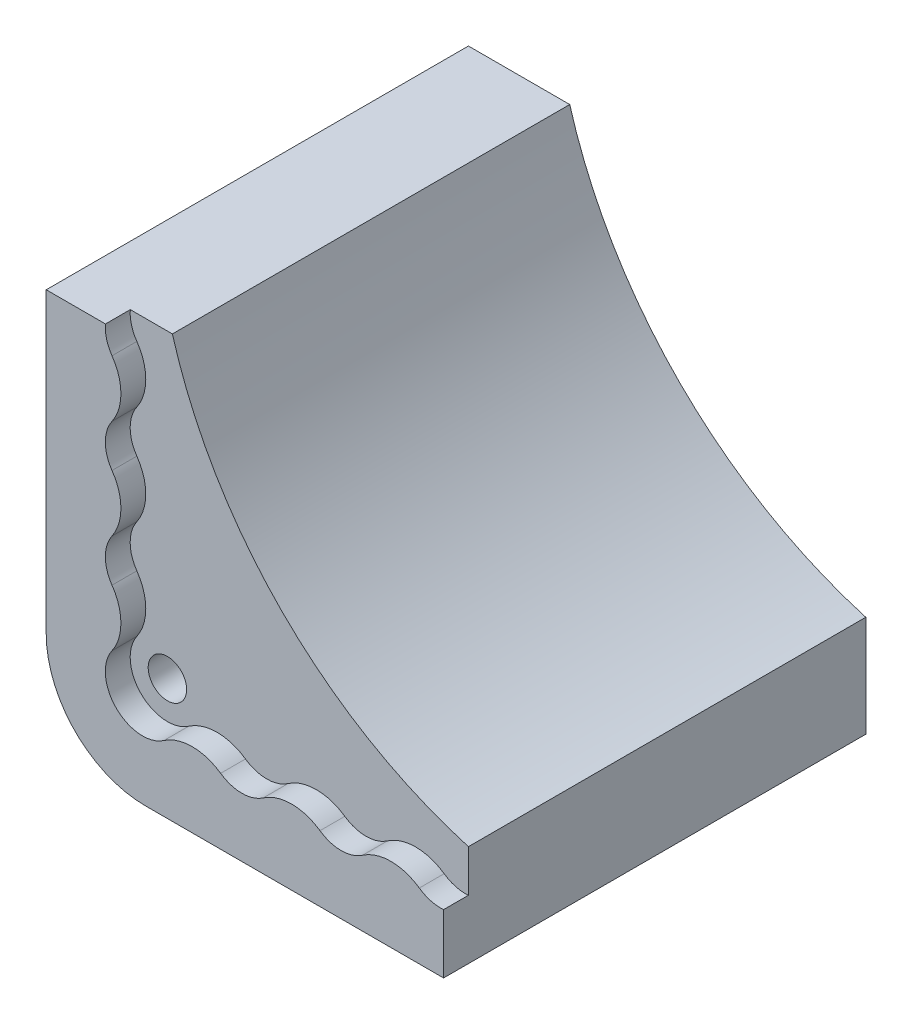
ISO-10303-21;
HEADER;
FILE_DESCRIPTION(('STEP AP214'),'2;1');
FILE_NAME('part.step','',(''),(''),'','','');
FILE_SCHEMA(('AUTOMOTIVE_DESIGN { 1 0 10303 214 1 1 1 1 }'));
ENDSEC;
DATA;
#1=APPLICATION_CONTEXT('core data for automotive mechanical design processes');
#2=APPLICATION_PROTOCOL_DEFINITION('international standard','automotive_design',2000,#1);
#3=PRODUCT_CONTEXT('',#1,'mechanical');
#4=PRODUCT('Part','Part','',(#3));
#5=PRODUCT_RELATED_PRODUCT_CATEGORY('part','',(#4));
#6=PRODUCT_DEFINITION_FORMATION('','',#4);
#7=PRODUCT_DEFINITION_CONTEXT('part definition',#1,'design');
#8=PRODUCT_DEFINITION('design','',#6,#7);
#9=PRODUCT_DEFINITION_SHAPE('','',#8);
#10=(LENGTH_UNIT() NAMED_UNIT(*) SI_UNIT(.MILLI.,.METRE.));
#11=(NAMED_UNIT(*) PLANE_ANGLE_UNIT() SI_UNIT($,.RADIAN.));
#12=(NAMED_UNIT(*) SI_UNIT($,.STERADIAN.) SOLID_ANGLE_UNIT());
#13=UNCERTAINTY_MEASURE_WITH_UNIT(LENGTH_MEASURE(1.E-05),#10,'distance_accuracy_value','');
#14=(GEOMETRIC_REPRESENTATION_CONTEXT(3) GLOBAL_UNCERTAINTY_ASSIGNED_CONTEXT((#13)) GLOBAL_UNIT_ASSIGNED_CONTEXT((#10,
#11,#12)) REPRESENTATION_CONTEXT('',''));
#15=CARTESIAN_POINT('',(0.,0.,0.));
#16=DIRECTION('',(0.,0.,1.));
#17=DIRECTION('',(1.,0.,0.));
#18=AXIS2_PLACEMENT_3D('',#15,#16,#17);
#19=CARTESIAN_POINT('',(12.319,12.319,53.975));
#20=DIRECTION('',(0.,0.,1.));
#21=DIRECTION('',(1.,0.,0.));
#22=AXIS2_PLACEMENT_3D('',#19,#20,#21);
#23=CYLINDRICAL_SURFACE('',#22,2.45744999999999);
#24=CARTESIAN_POINT('',(12.319,12.319,0.));
#25=DIRECTION('',(0.,0.,1.));
#26=DIRECTION('',(1.,0.,0.));
#27=AXIS2_PLACEMENT_3D('',#24,#25,#26);
#28=CIRCLE('',#27,2.45744999999999);
#29=CARTESIAN_POINT('',(14.77645,12.319,0.));
#30=VERTEX_POINT('',#29);
#31=EDGE_CURVE('E218',#30,#30,#28,.T.);
#32=ORIENTED_EDGE('',*,*,#31,.F.);
#33=EDGE_LOOP('',(#32));
#34=FACE_BOUND('',#33,.T.);
#35=CARTESIAN_POINT('',(12.319,12.319,50.8));
#36=DIRECTION('',(0.,0.,1.));
#37=DIRECTION('',(1.,0.,0.));
#38=AXIS2_PLACEMENT_3D('',#35,#36,#37);
#39=CIRCLE('',#38,2.45744999999999);
#40=CARTESIAN_POINT('',(14.77645,12.319,50.8));
#41=VERTEX_POINT('',#40);
#42=EDGE_CURVE('E277',#41,#41,#39,.F.);
#43=ORIENTED_EDGE('',*,*,#42,.F.);
#44=EDGE_LOOP('',(#43));
#45=FACE_BOUND('',#44,.T.);
#46=ADVANCED_FACE('F37',(#34,#45),#23,.F.);
#47=CARTESIAN_POINT('',(0.,0.,53.975));
#48=DIRECTION('',(0.,1.,0.));
#49=DIRECTION('',(0.,0.,1.));
#50=AXIS2_PLACEMENT_3D('',#47,#48,#49);
#51=PLANE('',#50);
#52=DIRECTION('',(0.,0.,1.));
#53=VECTOR('',#52,1.);
#54=CARTESIAN_POINT('',(12.7,0.,0.));
#55=LINE('',#54,#53);
#56=CARTESIAN_POINT('',(12.7,0.,0.));
#57=VERTEX_POINT('',#56);
#58=CARTESIAN_POINT('',(12.7,0.,53.975));
#59=VERTEX_POINT('',#58);
#60=EDGE_CURVE('E226',#57,#59,#55,.T.);
#61=ORIENTED_EDGE('',*,*,#60,.F.);
#62=DIRECTION('',(1.,0.,0.));
#63=VECTOR('',#62,1.);
#64=CARTESIAN_POINT('',(0.,0.,0.));
#65=LINE('',#64,#63);
#66=CARTESIAN_POINT('',(50.8,0.,0.));
#67=VERTEX_POINT('',#66);
#68=EDGE_CURVE('E203',#57,#67,#65,.T.);
#69=ORIENTED_EDGE('',*,*,#68,.T.);
#70=DIRECTION('',(0.,0.,-1.));
#71=VECTOR('',#70,1.);
#72=CARTESIAN_POINT('',(50.8,0.,53.975));
#73=LINE('',#72,#71);
#74=CARTESIAN_POINT('',(50.8,0.,53.975));
#75=VERTEX_POINT('',#74);
#76=EDGE_CURVE('E11',#75,#67,#73,.T.);
#77=ORIENTED_EDGE('',*,*,#76,.F.);
#78=DIRECTION('',(1.,0.,0.));
#79=VECTOR('',#78,1.);
#80=CARTESIAN_POINT('',(0.,0.,53.975));
#81=LINE('',#80,#79);
#82=EDGE_CURVE('E201',#59,#75,#81,.T.);
#83=ORIENTED_EDGE('',*,*,#82,.F.);
#84=EDGE_LOOP('',(#61,#69,#77,#83));
#85=FACE_BOUND('',#84,.T.);
#86=ADVANCED_FACE('F223',(#85),#51,.F.);
#87=CARTESIAN_POINT('',(0.,0.,53.975));
#88=DIRECTION('',(0.,0.,1.));
#89=DIRECTION('',(1.,0.,0.));
#90=AXIS2_PLACEMENT_3D('',#87,#88,#89);
#91=PLANE('',#90);
#92=CARTESIAN_POINT('',(12.3189999999996,50.419,53.975));
#93=DIRECTION('',(0.,0.,1.));
#94=DIRECTION('',(1.,0.,0.));
#95=AXIS2_PLACEMENT_3D('',#92,#93,#94);
#96=CIRCLE('',#95,4.76249999999993);
#97=CARTESIAN_POINT('',(7.57176446234196,50.8,53.975));
#98=VERTEX_POINT('',#97);
#99=CARTESIAN_POINT('',(8.41064577083715,47.6975714285715,53.975));
#100=VERTEX_POINT('',#99);
#101=EDGE_CURVE('E305',#98,#100,#96,.T.);
#102=ORIENTED_EDGE('',*,*,#101,.F.);
#103=DIRECTION('',(-1.,0.,0.));
#104=VECTOR('',#103,1.);
#105=CARTESIAN_POINT('',(25.4,50.8,53.975));
#106=LINE('',#105,#104);
#107=CARTESIAN_POINT('',(0.,50.8,53.975));
#108=VERTEX_POINT('',#107);
#109=EDGE_CURVE('E206',#98,#108,#106,.T.);
#110=ORIENTED_EDGE('',*,*,#109,.T.);
#111=DIRECTION('',(0.,-1.,0.));
#112=VECTOR('',#111,1.);
#113=CARTESIAN_POINT('',(0.,50.8,53.975));
#114=LINE('',#113,#112);
#115=CARTESIAN_POINT('',(0.,12.7,53.975));
#116=VERTEX_POINT('',#115);
#117=EDGE_CURVE('E197',#108,#116,#114,.T.);
#118=ORIENTED_EDGE('',*,*,#117,.T.);
#119=CARTESIAN_POINT('',(12.7,12.7,53.975));
#120=DIRECTION('',(0.,0.,1.));
#121=DIRECTION('',(1.,0.,0.));
#122=AXIS2_PLACEMENT_3D('',#119,#120,#121);
#123=CIRCLE('',#122,12.7);
#124=EDGE_CURVE('E237',#116,#59,#123,.T.);
#125=ORIENTED_EDGE('',*,*,#124,.T.);
#126=ORIENTED_EDGE('',*,*,#82,.T.);
#127=DIRECTION('',(0.,1.,0.));
#128=VECTOR('',#127,1.);
#129=CARTESIAN_POINT('',(50.8,0.,53.975));
#130=LINE('',#129,#128);
#131=CARTESIAN_POINT('',(50.8,7.57176446234279,53.975));
#132=VERTEX_POINT('',#131);
#133=EDGE_CURVE('E209',#75,#132,#130,.T.);
#134=ORIENTED_EDGE('',*,*,#133,.T.);
#135=CARTESIAN_POINT('',(50.419,12.3190000000004,53.975));
#136=DIRECTION('',(0.,0.,1.));
#137=DIRECTION('',(1.,0.,0.));
#138=AXIS2_PLACEMENT_3D('',#135,#136,#137);
#139=CIRCLE('',#138,4.76249999999992);
#140=CARTESIAN_POINT('',(47.6975714285715,8.41064577083791,53.975));
#141=VERTEX_POINT('',#140);
#142=EDGE_CURVE('E235',#141,#132,#139,.T.);
#143=ORIENTED_EDGE('',*,*,#142,.F.);
#144=CARTESIAN_POINT('',(44.0690000000001,3.19950679862127,53.975));
#145=DIRECTION('',(0.,0.,1.));
#146=DIRECTION('',(1.,0.,0.));
#147=AXIS2_PLACEMENT_3D('',#144,#145,#146);
#148=CIRCLE('',#147,6.35000000000002);
#149=CARTESIAN_POINT('',(40.4404285714286,8.41064577083788,53.975));
#150=VERTEX_POINT('',#149);
#151=EDGE_CURVE('E190',#141,#150,#148,.T.);
#152=ORIENTED_EDGE('',*,*,#151,.T.);
#153=CARTESIAN_POINT('',(37.719,12.3190000000003,53.975));
#154=DIRECTION('',(0.,0.,1.));
#155=DIRECTION('',(1.,0.,0.));
#156=AXIS2_PLACEMENT_3D('',#153,#154,#155);
#157=CIRCLE('',#156,4.76249999999992);
#158=CARTESIAN_POINT('',(34.9975714285715,8.4106457708378,53.975));
#159=VERTEX_POINT('',#158);
#160=EDGE_CURVE('E274',#159,#150,#157,.T.);
#161=ORIENTED_EDGE('',*,*,#160,.F.);
#162=CARTESIAN_POINT('',(31.3690000000001,3.19950679862115,53.975));
#163=DIRECTION('',(0.,0.,1.));
#164=DIRECTION('',(1.,0.,0.));
#165=AXIS2_PLACEMENT_3D('',#162,#163,#164);
#166=CIRCLE('',#165,6.34999999999998);
#167=CARTESIAN_POINT('',(27.7404285714286,8.41064577083774,53.975));
#168=VERTEX_POINT('',#167);
#169=EDGE_CURVE('E278',#159,#168,#166,.T.);
#170=ORIENTED_EDGE('',*,*,#169,.T.);
#171=CARTESIAN_POINT('',(25.019,12.3190000000001,53.975));
#172=DIRECTION('',(0.,0.,1.));
#173=DIRECTION('',(1.,0.,0.));
#174=AXIS2_PLACEMENT_3D('',#171,#172,#173);
#175=CIRCLE('',#174,4.76249999999997);
#176=CARTESIAN_POINT('',(22.2975714285715,8.41064577083764,53.975));
#177=VERTEX_POINT('',#176);
#178=EDGE_CURVE('E281',#177,#168,#175,.T.);
#179=ORIENTED_EDGE('',*,*,#178,.F.);
#180=CARTESIAN_POINT('',(18.6690000000001,3.19950679862095,53.975));
#181=DIRECTION('',(0.,0.,1.));
#182=DIRECTION('',(1.,0.,0.));
#183=AXIS2_PLACEMENT_3D('',#180,#181,#182);
#184=CIRCLE('',#183,6.35000000000001);
#185=CARTESIAN_POINT('',(15.0404285714286,8.41064577083755,53.975));
#186=VERTEX_POINT('',#185);
#187=EDGE_CURVE('E284',#177,#186,#184,.T.);
#188=ORIENTED_EDGE('',*,*,#187,.T.);
#189=CARTESIAN_POINT('',(12.319,12.319,53.975));
#190=DIRECTION('',(0.,0.,1.));
#191=DIRECTION('',(1.,0.,0.));
#192=AXIS2_PLACEMENT_3D('',#189,#190,#191);
#193=CIRCLE('',#192,4.7625);
#194=CARTESIAN_POINT('',(8.4106457708375,15.0404285714285,53.975));
#195=VERTEX_POINT('',#194);
#196=EDGE_CURVE('E287',#195,#186,#193,.T.);
#197=ORIENTED_EDGE('',*,*,#196,.F.);
#198=CARTESIAN_POINT('',(3.19950679862081,18.6689999999999,53.975));
#199=DIRECTION('',(0.,0.,1.));
#200=DIRECTION('',(1.,0.,0.));
#201=AXIS2_PLACEMENT_3D('',#198,#199,#200);
#202=CIRCLE('',#201,6.35);
#203=CARTESIAN_POINT('',(8.41064577083742,22.2975714285714,53.975));
#204=VERTEX_POINT('',#203);
#205=EDGE_CURVE('E290',#195,#204,#202,.T.);
#206=ORIENTED_EDGE('',*,*,#205,.T.);
#207=CARTESIAN_POINT('',(12.3189999999999,25.019,53.975));
#208=DIRECTION('',(0.,0.,1.));
#209=DIRECTION('',(1.,0.,0.));
#210=AXIS2_PLACEMENT_3D('',#207,#208,#209);
#211=CIRCLE('',#210,4.76249999999999);
#212=CARTESIAN_POINT('',(8.41064577083737,27.7404285714285,53.975));
#213=VERTEX_POINT('',#212);
#214=EDGE_CURVE('E293',#213,#204,#211,.T.);
#215=ORIENTED_EDGE('',*,*,#214,.F.);
#216=CARTESIAN_POINT('',(3.19950679862067,31.3689999999999,53.975));
#217=DIRECTION('',(0.,0.,1.));
#218=DIRECTION('',(1.,0.,0.));
#219=AXIS2_PLACEMENT_3D('',#216,#217,#218);
#220=CIRCLE('',#219,6.35000000000002);
#221=CARTESIAN_POINT('',(8.41064577083727,34.9975714285714,53.975));
#222=VERTEX_POINT('',#221);
#223=EDGE_CURVE('E296',#213,#222,#220,.T.);
#224=ORIENTED_EDGE('',*,*,#223,.T.);
#225=CARTESIAN_POINT('',(12.3189999999997,37.719,53.975));
#226=DIRECTION('',(0.,0.,1.));
#227=DIRECTION('',(1.,0.,0.));
#228=AXIS2_PLACEMENT_3D('',#225,#226,#227);
#229=CIRCLE('',#228,4.76249999999999);
#230=CARTESIAN_POINT('',(8.41064577083724,40.4404285714286,53.975));
#231=VERTEX_POINT('',#230);
#232=EDGE_CURVE('E299',#231,#222,#229,.T.);
#233=ORIENTED_EDGE('',*,*,#232,.F.);
#234=CARTESIAN_POINT('',(3.1995067986206,44.0689999999999,53.975));
#235=DIRECTION('',(0.,0.,1.));
#236=DIRECTION('',(1.,0.,0.));
#237=AXIS2_PLACEMENT_3D('',#234,#235,#236);
#238=CIRCLE('',#237,6.34999999999999);
#239=EDGE_CURVE('E302',#231,#100,#238,.T.);
#240=ORIENTED_EDGE('',*,*,#239,.T.);
#241=EDGE_LOOP('',(#102,#110,#118,#125,#126,#134,#143,#152,#161,#170,#179,#188,#197,#206,#215,
#224,#233,#240));
#242=FACE_BOUND('',#241,.T.);
#243=ADVANCED_FACE('F233',(#242),#91,.T.);
#244=CARTESIAN_POINT('',(0.,0.,0.));
#245=DIRECTION('',(0.,0.,1.));
#246=DIRECTION('',(1.,0.,0.));
#247=AXIS2_PLACEMENT_3D('',#244,#245,#246);
#248=PLANE('',#247);
#249=CARTESIAN_POINT('',(66.3083196686534,66.3083196686535,0.));
#250=DIRECTION('',(0.,0.,1.));
#251=DIRECTION('',(1.,0.,0.));
#252=AXIS2_PLACEMENT_3D('',#249,#250,#251);
#253=CIRCLE('',#252,55.5625);
#254=CARTESIAN_POINT('',(12.954,50.8,0.));
#255=VERTEX_POINT('',#254);
#256=CARTESIAN_POINT('',(50.8,12.954,0.));
#257=VERTEX_POINT('',#256);
#258=EDGE_CURVE('E172',#255,#257,#253,.T.);
#259=ORIENTED_EDGE('',*,*,#258,.T.);
#260=DIRECTION('',(0.,1.,0.));
#261=VECTOR('',#260,1.);
#262=CARTESIAN_POINT('',(50.8,0.,0.));
#263=LINE('',#262,#261);
#264=EDGE_CURVE('E198',#67,#257,#263,.T.);
#265=ORIENTED_EDGE('',*,*,#264,.F.);
#266=ORIENTED_EDGE('',*,*,#68,.F.);
#267=CARTESIAN_POINT('',(12.7,12.7,0.));
#268=DIRECTION('',(0.,0.,1.));
#269=DIRECTION('',(1.,0.,0.));
#270=AXIS2_PLACEMENT_3D('',#267,#268,#269);
#271=CIRCLE('',#270,12.7);
#272=CARTESIAN_POINT('',(0.,12.7,0.));
#273=VERTEX_POINT('',#272);
#274=EDGE_CURVE('E242',#273,#57,#271,.T.);
#275=ORIENTED_EDGE('',*,*,#274,.F.);
#276=DIRECTION('',(0.,-1.,0.));
#277=VECTOR('',#276,1.);
#278=CARTESIAN_POINT('',(0.,50.8,0.));
#279=LINE('',#278,#277);
#280=CARTESIAN_POINT('',(0.,50.8,0.));
#281=VERTEX_POINT('',#280);
#282=EDGE_CURVE('E196',#281,#273,#279,.T.);
#283=ORIENTED_EDGE('',*,*,#282,.F.);
#284=DIRECTION('',(-1.,0.,0.));
#285=VECTOR('',#284,1.);
#286=CARTESIAN_POINT('',(25.4,50.8,0.));
#287=LINE('',#286,#285);
#288=EDGE_CURVE('E186',#255,#281,#287,.T.);
#289=ORIENTED_EDGE('',*,*,#288,.F.);
#290=EDGE_LOOP('',(#259,#265,#266,#275,#283,#289));
#291=FACE_BOUND('',#290,.T.);
#292=ORIENTED_EDGE('',*,*,#31,.T.);
#293=EDGE_LOOP('',(#292));
#294=FACE_BOUND('',#293,.T.);
#295=ADVANCED_FACE('F193',(#291,#294),#248,.F.);
#296=CARTESIAN_POINT('',(0.,50.8,53.975));
#297=DIRECTION('',(1.,0.,0.));
#298=DIRECTION('',(0.,1.,0.));
#299=AXIS2_PLACEMENT_3D('',#296,#297,#298);
#300=PLANE('',#299);
#301=ORIENTED_EDGE('',*,*,#282,.T.);
#302=DIRECTION('',(0.,0.,1.));
#303=VECTOR('',#302,1.);
#304=CARTESIAN_POINT('',(0.,12.7,0.));
#305=LINE('',#304,#303);
#306=EDGE_CURVE('E60',#273,#116,#305,.T.);
#307=ORIENTED_EDGE('',*,*,#306,.T.);
#308=ORIENTED_EDGE('',*,*,#117,.F.);
#309=DIRECTION('',(0.,0.,-1.));
#310=VECTOR('',#309,1.);
#311=CARTESIAN_POINT('',(0.,50.8,53.975));
#312=LINE('',#311,#310);
#313=EDGE_CURVE('E45',#108,#281,#312,.T.);
#314=ORIENTED_EDGE('',*,*,#313,.T.);
#315=EDGE_LOOP('',(#301,#307,#308,#314));
#316=FACE_BOUND('',#315,.T.);
#317=ADVANCED_FACE('F39',(#316),#300,.F.);
#318=CARTESIAN_POINT('',(50.8,0.,53.975));
#319=DIRECTION('',(-1.,0.,0.));
#320=DIRECTION('',(0.,-1.,0.));
#321=AXIS2_PLACEMENT_3D('',#318,#319,#320);
#322=PLANE('',#321);
#323=ORIENTED_EDGE('',*,*,#264,.T.);
#324=DIRECTION('',(0.,0.,1.));
#325=VECTOR('',#324,1.);
#326=CARTESIAN_POINT('',(50.8,12.954,0.));
#327=LINE('',#326,#325);
#328=CARTESIAN_POINT('',(50.8,12.954,50.8));
#329=VERTEX_POINT('',#328);
#330=EDGE_CURVE('E175',#257,#329,#327,.T.);
#331=ORIENTED_EDGE('',*,*,#330,.T.);
#332=DIRECTION('',(0.,1.,0.));
#333=VECTOR('',#332,1.);
#334=CARTESIAN_POINT('',(50.8,0.,50.8));
#335=LINE('',#334,#333);
#336=CARTESIAN_POINT('',(50.8,7.57176446234279,50.8));
#337=VERTEX_POINT('',#336);
#338=EDGE_CURVE('E338',#337,#329,#335,.T.);
#339=ORIENTED_EDGE('',*,*,#338,.F.);
#340=DIRECTION('',(0.,0.,1.));
#341=VECTOR('',#340,1.);
#342=CARTESIAN_POINT('',(50.8,7.57176446234279,50.8));
#343=LINE('',#342,#341);
#344=EDGE_CURVE('E231',#337,#132,#343,.T.);
#345=ORIENTED_EDGE('',*,*,#344,.T.);
#346=ORIENTED_EDGE('',*,*,#133,.F.);
#347=ORIENTED_EDGE('',*,*,#76,.T.);
#348=EDGE_LOOP('',(#323,#331,#339,#345,#346,#347));
#349=FACE_BOUND('',#348,.T.);
#350=ADVANCED_FACE('F228',(#349),#322,.F.);
#351=CARTESIAN_POINT('',(25.4,50.8,53.975));
#352=DIRECTION('',(0.,-1.,0.));
#353=DIRECTION('',(0.,0.,-1.));
#354=AXIS2_PLACEMENT_3D('',#351,#352,#353);
#355=PLANE('',#354);
#356=DIRECTION('',(-1.,0.,0.));
#357=VECTOR('',#356,1.);
#358=CARTESIAN_POINT('',(0.,50.8,50.8));
#359=LINE('',#358,#357);
#360=CARTESIAN_POINT('',(12.954,50.8,50.8));
#361=VERTEX_POINT('',#360);
#362=CARTESIAN_POINT('',(7.57176446234196,50.8,50.8));
#363=VERTEX_POINT('',#362);
#364=EDGE_CURVE('E189',#361,#363,#359,.T.);
#365=ORIENTED_EDGE('',*,*,#364,.F.);
#366=DIRECTION('',(0.,0.,1.));
#367=VECTOR('',#366,1.);
#368=CARTESIAN_POINT('',(12.954,50.8,0.));
#369=LINE('',#368,#367);
#370=EDGE_CURVE('E52',#255,#361,#369,.T.);
#371=ORIENTED_EDGE('',*,*,#370,.F.);
#372=ORIENTED_EDGE('',*,*,#288,.T.);
#373=ORIENTED_EDGE('',*,*,#313,.F.);
#374=ORIENTED_EDGE('',*,*,#109,.F.);
#375=DIRECTION('',(0.,0.,1.));
#376=VECTOR('',#375,1.);
#377=CARTESIAN_POINT('',(7.57176446234196,50.8,50.8));
#378=LINE('',#377,#376);
#379=EDGE_CURVE('E251',#363,#98,#378,.T.);
#380=ORIENTED_EDGE('',*,*,#379,.F.);
#381=EDGE_LOOP('',(#365,#371,#372,#373,#374,#380));
#382=FACE_BOUND('',#381,.T.);
#383=ADVANCED_FACE('F184',(#382),#355,.F.);
#384=CARTESIAN_POINT('',(12.7,12.7,0.));
#385=DIRECTION('',(0.,0.,1.));
#386=DIRECTION('',(1.,0.,0.));
#387=AXIS2_PLACEMENT_3D('',#384,#385,#386);
#388=CYLINDRICAL_SURFACE('',#387,12.7);
#389=ORIENTED_EDGE('',*,*,#124,.F.);
#390=ORIENTED_EDGE('',*,*,#306,.F.);
#391=ORIENTED_EDGE('',*,*,#274,.T.);
#392=ORIENTED_EDGE('',*,*,#60,.T.);
#393=EDGE_LOOP('',(#389,#390,#391,#392));
#394=FACE_BOUND('',#393,.T.);
#395=ADVANCED_FACE('F425',(#394),#388,.T.);
#396=CARTESIAN_POINT('',(44.0690000000001,3.19950679862127,50.8));
#397=DIRECTION('',(0.,0.,1.));
#398=DIRECTION('',(1.,0.,0.));
#399=AXIS2_PLACEMENT_3D('',#396,#397,#398);
#400=CYLINDRICAL_SURFACE('',#399,6.35000000000002);
#401=ORIENTED_EDGE('',*,*,#151,.F.);
#402=DIRECTION('',(0.,0.,1.));
#403=VECTOR('',#402,1.);
#404=CARTESIAN_POINT('',(47.6975714285715,8.41064577083791,50.8));
#405=LINE('',#404,#403);
#406=CARTESIAN_POINT('',(47.6975714285715,8.41064577083791,50.8));
#407=VERTEX_POINT('',#406);
#408=EDGE_CURVE('E247',#407,#141,#405,.T.);
#409=ORIENTED_EDGE('',*,*,#408,.F.);
#410=CARTESIAN_POINT('',(44.0690000000001,3.19950679862127,50.8));
#411=DIRECTION('',(0.,0.,1.));
#412=DIRECTION('',(1.,0.,0.));
#413=AXIS2_PLACEMENT_3D('',#410,#411,#412);
#414=CIRCLE('',#413,6.35000000000002);
#415=CARTESIAN_POINT('',(40.4404285714286,8.41064577083788,50.8));
#416=VERTEX_POINT('',#415);
#417=EDGE_CURVE('E344',#407,#416,#414,.T.);
#418=ORIENTED_EDGE('',*,*,#417,.T.);
#419=DIRECTION('',(0.,0.,1.));
#420=VECTOR('',#419,1.);
#421=CARTESIAN_POINT('',(40.4404285714286,8.41064577083788,50.8));
#422=LINE('',#421,#420);
#423=EDGE_CURVE('E245',#416,#150,#422,.T.);
#424=ORIENTED_EDGE('',*,*,#423,.T.);
#425=EDGE_LOOP('',(#401,#409,#418,#424));
#426=FACE_BOUND('',#425,.T.);
#427=ADVANCED_FACE('F358',(#426),#400,.T.);
#428=CARTESIAN_POINT('',(37.719,12.3190000000003,50.8));
#429=DIRECTION('',(0.,0.,1.));
#430=DIRECTION('',(1.,0.,0.));
#431=AXIS2_PLACEMENT_3D('',#428,#429,#430);
#432=CYLINDRICAL_SURFACE('',#431,4.76249999999992);
#433=ORIENTED_EDGE('',*,*,#160,.T.);
#434=ORIENTED_EDGE('',*,*,#423,.F.);
#435=CARTESIAN_POINT('',(37.719,12.3190000000003,50.8));
#436=DIRECTION('',(0.,0.,1.));
#437=DIRECTION('',(1.,0.,0.));
#438=AXIS2_PLACEMENT_3D('',#435,#436,#437);
#439=CIRCLE('',#438,4.76249999999992);
#440=CARTESIAN_POINT('',(34.9975714285715,8.4106457708378,50.8));
#441=VERTEX_POINT('',#440);
#442=EDGE_CURVE('E249',#441,#416,#439,.T.);
#443=ORIENTED_EDGE('',*,*,#442,.F.);
#444=DIRECTION('',(0.,0.,1.));
#445=VECTOR('',#444,1.);
#446=CARTESIAN_POINT('',(34.9975714285715,8.4106457708378,50.8));
#447=LINE('',#446,#445);
#448=EDGE_CURVE('E271',#441,#159,#447,.T.);
#449=ORIENTED_EDGE('',*,*,#448,.T.);
#450=EDGE_LOOP('',(#433,#434,#443,#449));
#451=FACE_BOUND('',#450,.T.);
#452=ADVANCED_FACE('F364',(#451),#432,.F.);
#453=CARTESIAN_POINT('',(31.3690000000001,3.19950679862115,50.8));
#454=DIRECTION('',(0.,0.,1.));
#455=DIRECTION('',(1.,0.,0.));
#456=AXIS2_PLACEMENT_3D('',#453,#454,#455);
#457=CYLINDRICAL_SURFACE('',#456,6.34999999999998);
#458=ORIENTED_EDGE('',*,*,#169,.F.);
#459=ORIENTED_EDGE('',*,*,#448,.F.);
#460=CARTESIAN_POINT('',(31.3690000000001,3.19950679862115,50.8));
#461=DIRECTION('',(0.,0.,1.));
#462=DIRECTION('',(1.,0.,0.));
#463=AXIS2_PLACEMENT_3D('',#460,#461,#462);
#464=CIRCLE('',#463,6.34999999999998);
#465=CARTESIAN_POINT('',(27.7404285714286,8.41064577083774,50.8));
#466=VERTEX_POINT('',#465);
#467=EDGE_CURVE('E312',#441,#466,#464,.T.);
#468=ORIENTED_EDGE('',*,*,#467,.T.);
#469=DIRECTION('',(0.,0.,1.));
#470=VECTOR('',#469,1.);
#471=CARTESIAN_POINT('',(27.7404285714286,8.41064577083774,50.8));
#472=LINE('',#471,#470);
#473=EDGE_CURVE('E269',#466,#168,#472,.T.);
#474=ORIENTED_EDGE('',*,*,#473,.T.);
#475=EDGE_LOOP('',(#458,#459,#468,#474));
#476=FACE_BOUND('',#475,.T.);
#477=ADVANCED_FACE('F368',(#476),#457,.T.);
#478=CARTESIAN_POINT('',(25.019,12.3190000000001,50.8));
#479=DIRECTION('',(0.,0.,1.));
#480=DIRECTION('',(1.,0.,0.));
#481=AXIS2_PLACEMENT_3D('',#478,#479,#480);
#482=CYLINDRICAL_SURFACE('',#481,4.76249999999997);
#483=ORIENTED_EDGE('',*,*,#178,.T.);
#484=ORIENTED_EDGE('',*,*,#473,.F.);
#485=CARTESIAN_POINT('',(25.019,12.3190000000001,50.8));
#486=DIRECTION('',(0.,0.,1.));
#487=DIRECTION('',(1.,0.,0.));
#488=AXIS2_PLACEMENT_3D('',#485,#486,#487);
#489=CIRCLE('',#488,4.76249999999997);
#490=CARTESIAN_POINT('',(22.2975714285715,8.41064577083764,50.8));
#491=VERTEX_POINT('',#490);
#492=EDGE_CURVE('E314',#491,#466,#489,.T.);
#493=ORIENTED_EDGE('',*,*,#492,.F.);
#494=DIRECTION('',(0.,0.,1.));
#495=VECTOR('',#494,1.);
#496=CARTESIAN_POINT('',(22.2975714285715,8.41064577083764,50.8));
#497=LINE('',#496,#495);
#498=EDGE_CURVE('E267',#491,#177,#497,.T.);
#499=ORIENTED_EDGE('',*,*,#498,.T.);
#500=EDGE_LOOP('',(#483,#484,#493,#499));
#501=FACE_BOUND('',#500,.T.);
#502=ADVANCED_FACE('F372',(#501),#482,.F.);
#503=CARTESIAN_POINT('',(18.6690000000001,3.19950679862095,50.8));
#504=DIRECTION('',(0.,0.,1.));
#505=DIRECTION('',(1.,0.,0.));
#506=AXIS2_PLACEMENT_3D('',#503,#504,#505);
#507=CYLINDRICAL_SURFACE('',#506,6.35000000000001);
#508=ORIENTED_EDGE('',*,*,#187,.F.);
#509=ORIENTED_EDGE('',*,*,#498,.F.);
#510=CARTESIAN_POINT('',(18.6690000000001,3.19950679862095,50.8));
#511=DIRECTION('',(0.,0.,1.));
#512=DIRECTION('',(1.,0.,0.));
#513=AXIS2_PLACEMENT_3D('',#510,#511,#512);
#514=CIRCLE('',#513,6.35000000000001);
#515=CARTESIAN_POINT('',(15.0404285714286,8.41064577083755,50.8));
#516=VERTEX_POINT('',#515);
#517=EDGE_CURVE('E317',#491,#516,#514,.T.);
#518=ORIENTED_EDGE('',*,*,#517,.T.);
#519=DIRECTION('',(0.,0.,1.));
#520=VECTOR('',#519,1.);
#521=CARTESIAN_POINT('',(15.0404285714286,8.41064577083755,50.8));
#522=LINE('',#521,#520);
#523=EDGE_CURVE('E265',#516,#186,#522,.T.);
#524=ORIENTED_EDGE('',*,*,#523,.T.);
#525=EDGE_LOOP('',(#508,#509,#518,#524));
#526=FACE_BOUND('',#525,.T.);
#527=ADVANCED_FACE('F376',(#526),#507,.T.);
#528=CARTESIAN_POINT('',(12.319,12.319,50.8));
#529=DIRECTION('',(0.,0.,1.));
#530=DIRECTION('',(1.,0.,0.));
#531=AXIS2_PLACEMENT_3D('',#528,#529,#530);
#532=CYLINDRICAL_SURFACE('',#531,4.7625);
#533=ORIENTED_EDGE('',*,*,#196,.T.);
#534=ORIENTED_EDGE('',*,*,#523,.F.);
#535=CARTESIAN_POINT('',(12.319,12.319,50.8));
#536=DIRECTION('',(0.,0.,1.));
#537=DIRECTION('',(1.,0.,0.));
#538=AXIS2_PLACEMENT_3D('',#535,#536,#537);
#539=CIRCLE('',#538,4.7625);
#540=CARTESIAN_POINT('',(8.4106457708375,15.0404285714285,50.8));
#541=VERTEX_POINT('',#540);
#542=EDGE_CURVE('E319',#541,#516,#539,.T.);
#543=ORIENTED_EDGE('',*,*,#542,.F.);
#544=DIRECTION('',(0.,0.,1.));
#545=VECTOR('',#544,1.);
#546=CARTESIAN_POINT('',(8.4106457708375,15.0404285714285,50.8));
#547=LINE('',#546,#545);
#548=EDGE_CURVE('E263',#541,#195,#547,.T.);
#549=ORIENTED_EDGE('',*,*,#548,.T.);
#550=EDGE_LOOP('',(#533,#534,#543,#549));
#551=FACE_BOUND('',#550,.T.);
#552=ADVANCED_FACE('F381',(#551),#532,.F.);
#553=CARTESIAN_POINT('',(3.19950679862081,18.6689999999999,50.8));
#554=DIRECTION('',(0.,0.,1.));
#555=DIRECTION('',(1.,0.,0.));
#556=AXIS2_PLACEMENT_3D('',#553,#554,#555);
#557=CYLINDRICAL_SURFACE('',#556,6.35);
#558=ORIENTED_EDGE('',*,*,#205,.F.);
#559=ORIENTED_EDGE('',*,*,#548,.F.);
#560=CARTESIAN_POINT('',(3.19950679862081,18.6689999999999,50.8));
#561=DIRECTION('',(0.,0.,1.));
#562=DIRECTION('',(1.,0.,0.));
#563=AXIS2_PLACEMENT_3D('',#560,#561,#562);
#564=CIRCLE('',#563,6.35);
#565=CARTESIAN_POINT('',(8.41064577083742,22.2975714285714,50.8));
#566=VERTEX_POINT('',#565);
#567=EDGE_CURVE('E322',#541,#566,#564,.T.);
#568=ORIENTED_EDGE('',*,*,#567,.T.);
#569=DIRECTION('',(0.,0.,1.));
#570=VECTOR('',#569,1.);
#571=CARTESIAN_POINT('',(8.41064577083742,22.2975714285714,50.8));
#572=LINE('',#571,#570);
#573=EDGE_CURVE('E261',#566,#204,#572,.T.);
#574=ORIENTED_EDGE('',*,*,#573,.T.);
#575=EDGE_LOOP('',(#558,#559,#568,#574));
#576=FACE_BOUND('',#575,.T.);
#577=ADVANCED_FACE('F385',(#576),#557,.T.);
#578=CARTESIAN_POINT('',(12.3189999999999,25.019,50.8));
#579=DIRECTION('',(0.,0.,1.));
#580=DIRECTION('',(1.,0.,0.));
#581=AXIS2_PLACEMENT_3D('',#578,#579,#580);
#582=CYLINDRICAL_SURFACE('',#581,4.76249999999999);
#583=ORIENTED_EDGE('',*,*,#214,.T.);
#584=ORIENTED_EDGE('',*,*,#573,.F.);
#585=CARTESIAN_POINT('',(12.3189999999999,25.019,50.8));
#586=DIRECTION('',(0.,0.,1.));
#587=DIRECTION('',(1.,0.,0.));
#588=AXIS2_PLACEMENT_3D('',#585,#586,#587);
#589=CIRCLE('',#588,4.76249999999999);
#590=CARTESIAN_POINT('',(8.41064577083737,27.7404285714285,50.8));
#591=VERTEX_POINT('',#590);
#592=EDGE_CURVE('E324',#591,#566,#589,.T.);
#593=ORIENTED_EDGE('',*,*,#592,.F.);
#594=DIRECTION('',(0.,0.,1.));
#595=VECTOR('',#594,1.);
#596=CARTESIAN_POINT('',(8.41064577083737,27.7404285714285,50.8));
#597=LINE('',#596,#595);
#598=EDGE_CURVE('E259',#591,#213,#597,.T.);
#599=ORIENTED_EDGE('',*,*,#598,.T.);
#600=EDGE_LOOP('',(#583,#584,#593,#599));
#601=FACE_BOUND('',#600,.T.);
#602=ADVANCED_FACE('F391',(#601),#582,.F.);
#603=CARTESIAN_POINT('',(3.19950679862067,31.3689999999999,50.8));
#604=DIRECTION('',(0.,0.,1.));
#605=DIRECTION('',(1.,0.,0.));
#606=AXIS2_PLACEMENT_3D('',#603,#604,#605);
#607=CYLINDRICAL_SURFACE('',#606,6.35000000000002);
#608=ORIENTED_EDGE('',*,*,#223,.F.);
#609=ORIENTED_EDGE('',*,*,#598,.F.);
#610=CARTESIAN_POINT('',(3.19950679862067,31.3689999999999,50.8));
#611=DIRECTION('',(0.,0.,1.));
#612=DIRECTION('',(1.,0.,0.));
#613=AXIS2_PLACEMENT_3D('',#610,#611,#612);
#614=CIRCLE('',#613,6.35000000000002);
#615=CARTESIAN_POINT('',(8.41064577083727,34.9975714285714,50.8));
#616=VERTEX_POINT('',#615);
#617=EDGE_CURVE('E327',#591,#616,#614,.T.);
#618=ORIENTED_EDGE('',*,*,#617,.T.);
#619=DIRECTION('',(0.,0.,1.));
#620=VECTOR('',#619,1.);
#621=CARTESIAN_POINT('',(8.41064577083727,34.9975714285714,50.8));
#622=LINE('',#621,#620);
#623=EDGE_CURVE('E257',#616,#222,#622,.T.);
#624=ORIENTED_EDGE('',*,*,#623,.T.);
#625=EDGE_LOOP('',(#608,#609,#618,#624));
#626=FACE_BOUND('',#625,.T.);
#627=ADVANCED_FACE('F395',(#626),#607,.T.);
#628=CARTESIAN_POINT('',(12.3189999999997,37.719,50.8));
#629=DIRECTION('',(0.,0.,1.));
#630=DIRECTION('',(1.,0.,0.));
#631=AXIS2_PLACEMENT_3D('',#628,#629,#630);
#632=CYLINDRICAL_SURFACE('',#631,4.76249999999999);
#633=ORIENTED_EDGE('',*,*,#232,.T.);
#634=ORIENTED_EDGE('',*,*,#623,.F.);
#635=CARTESIAN_POINT('',(12.3189999999997,37.719,50.8));
#636=DIRECTION('',(0.,0.,1.));
#637=DIRECTION('',(1.,0.,0.));
#638=AXIS2_PLACEMENT_3D('',#635,#636,#637);
#639=CIRCLE('',#638,4.76249999999999);
#640=CARTESIAN_POINT('',(8.41064577083724,40.4404285714286,50.8));
#641=VERTEX_POINT('',#640);
#642=EDGE_CURVE('E329',#641,#616,#639,.T.);
#643=ORIENTED_EDGE('',*,*,#642,.F.);
#644=DIRECTION('',(0.,0.,1.));
#645=VECTOR('',#644,1.);
#646=CARTESIAN_POINT('',(8.41064577083724,40.4404285714286,50.8));
#647=LINE('',#646,#645);
#648=EDGE_CURVE('E255',#641,#231,#647,.T.);
#649=ORIENTED_EDGE('',*,*,#648,.T.);
#650=EDGE_LOOP('',(#633,#634,#643,#649));
#651=FACE_BOUND('',#650,.T.);
#652=ADVANCED_FACE('F399',(#651),#632,.F.);
#653=CARTESIAN_POINT('',(3.1995067986206,44.0689999999999,50.8));
#654=DIRECTION('',(0.,0.,1.));
#655=DIRECTION('',(1.,0.,0.));
#656=AXIS2_PLACEMENT_3D('',#653,#654,#655);
#657=CYLINDRICAL_SURFACE('',#656,6.34999999999999);
#658=ORIENTED_EDGE('',*,*,#239,.F.);
#659=ORIENTED_EDGE('',*,*,#648,.F.);
#660=CARTESIAN_POINT('',(3.1995067986206,44.0689999999999,50.8));
#661=DIRECTION('',(0.,0.,1.));
#662=DIRECTION('',(1.,0.,0.));
#663=AXIS2_PLACEMENT_3D('',#660,#661,#662);
#664=CIRCLE('',#663,6.34999999999999);
#665=CARTESIAN_POINT('',(8.41064577083715,47.6975714285715,50.8));
#666=VERTEX_POINT('',#665);
#667=EDGE_CURVE('E332',#641,#666,#664,.T.);
#668=ORIENTED_EDGE('',*,*,#667,.T.);
#669=DIRECTION('',(0.,0.,1.));
#670=VECTOR('',#669,1.);
#671=CARTESIAN_POINT('',(8.41064577083715,47.6975714285715,50.8));
#672=LINE('',#671,#670);
#673=EDGE_CURVE('E253',#666,#100,#672,.T.);
#674=ORIENTED_EDGE('',*,*,#673,.T.);
#675=EDGE_LOOP('',(#658,#659,#668,#674));
#676=FACE_BOUND('',#675,.T.);
#677=ADVANCED_FACE('F402',(#676),#657,.T.);
#678=CARTESIAN_POINT('',(12.3189999999996,50.419,50.8));
#679=DIRECTION('',(0.,0.,1.));
#680=DIRECTION('',(1.,0.,0.));
#681=AXIS2_PLACEMENT_3D('',#678,#679,#680);
#682=CYLINDRICAL_SURFACE('',#681,4.76249999999993);
#683=ORIENTED_EDGE('',*,*,#101,.T.);
#684=ORIENTED_EDGE('',*,*,#673,.F.);
#685=CARTESIAN_POINT('',(12.3189999999996,50.419,50.8));
#686=DIRECTION('',(0.,0.,1.));
#687=DIRECTION('',(1.,0.,0.));
#688=AXIS2_PLACEMENT_3D('',#685,#686,#687);
#689=CIRCLE('',#688,4.76249999999993);
#690=EDGE_CURVE('E334',#363,#666,#689,.T.);
#691=ORIENTED_EDGE('',*,*,#690,.F.);
#692=ORIENTED_EDGE('',*,*,#379,.T.);
#693=EDGE_LOOP('',(#683,#684,#691,#692));
#694=FACE_BOUND('',#693,.T.);
#695=ADVANCED_FACE('F407',(#694),#682,.F.);
#696=CARTESIAN_POINT('',(50.419,12.3190000000004,50.8));
#697=DIRECTION('',(0.,0.,1.));
#698=DIRECTION('',(1.,0.,0.));
#699=AXIS2_PLACEMENT_3D('',#696,#697,#698);
#700=CYLINDRICAL_SURFACE('',#699,4.76249999999992);
#701=ORIENTED_EDGE('',*,*,#142,.T.);
#702=ORIENTED_EDGE('',*,*,#344,.F.);
#703=CARTESIAN_POINT('',(50.419,12.3190000000004,50.8));
#704=DIRECTION('',(0.,0.,1.));
#705=DIRECTION('',(1.,0.,0.));
#706=AXIS2_PLACEMENT_3D('',#703,#704,#705);
#707=CIRCLE('',#706,4.76249999999992);
#708=EDGE_CURVE('E341',#407,#337,#707,.T.);
#709=ORIENTED_EDGE('',*,*,#708,.F.);
#710=ORIENTED_EDGE('',*,*,#408,.T.);
#711=EDGE_LOOP('',(#701,#702,#709,#710));
#712=FACE_BOUND('',#711,.T.);
#713=ADVANCED_FACE('F355',(#712),#700,.F.);
#714=CARTESIAN_POINT('',(0.,0.,50.8));
#715=DIRECTION('',(0.,0.,1.));
#716=DIRECTION('',(1.,0.,0.));
#717=AXIS2_PLACEMENT_3D('',#714,#715,#716);
#718=PLANE('',#717);
#719=ORIENTED_EDGE('',*,*,#338,.T.);
#720=CARTESIAN_POINT('',(66.3083196686534,66.3083196686535,50.8));
#721=DIRECTION('',(0.,0.,1.));
#722=DIRECTION('',(1.,0.,0.));
#723=AXIS2_PLACEMENT_3D('',#720,#721,#722);
#724=CIRCLE('',#723,55.5625);
#725=EDGE_CURVE('E180',#361,#329,#724,.T.);
#726=ORIENTED_EDGE('',*,*,#725,.F.);
#727=ORIENTED_EDGE('',*,*,#364,.T.);
#728=ORIENTED_EDGE('',*,*,#690,.T.);
#729=ORIENTED_EDGE('',*,*,#667,.F.);
#730=ORIENTED_EDGE('',*,*,#642,.T.);
#731=ORIENTED_EDGE('',*,*,#617,.F.);
#732=ORIENTED_EDGE('',*,*,#592,.T.);
#733=ORIENTED_EDGE('',*,*,#567,.F.);
#734=ORIENTED_EDGE('',*,*,#542,.T.);
#735=ORIENTED_EDGE('',*,*,#517,.F.);
#736=ORIENTED_EDGE('',*,*,#492,.T.);
#737=ORIENTED_EDGE('',*,*,#467,.F.);
#738=ORIENTED_EDGE('',*,*,#442,.T.);
#739=ORIENTED_EDGE('',*,*,#417,.F.);
#740=ORIENTED_EDGE('',*,*,#708,.T.);
#741=EDGE_LOOP('',(#719,#726,#727,#728,#729,#730,#731,#732,#733,#734,#735,#736,#737,#738,#739,#740));
#742=FACE_BOUND('',#741,.T.);
#743=ORIENTED_EDGE('',*,*,#42,.T.);
#744=EDGE_LOOP('',(#743));
#745=FACE_BOUND('',#744,.T.);
#746=ADVANCED_FACE('F350',(#742,#745),#718,.T.);
#747=CARTESIAN_POINT('',(66.3083196686534,66.3083196686535,0.));
#748=DIRECTION('',(0.,0.,1.));
#749=DIRECTION('',(1.,0.,0.));
#750=AXIS2_PLACEMENT_3D('',#747,#748,#749);
#751=CYLINDRICAL_SURFACE('',#750,55.5625);
#752=ORIENTED_EDGE('',*,*,#725,.T.);
#753=ORIENTED_EDGE('',*,*,#330,.F.);
#754=ORIENTED_EDGE('',*,*,#258,.F.);
#755=ORIENTED_EDGE('',*,*,#370,.T.);
#756=EDGE_LOOP('',(#752,#753,#754,#755));
#757=FACE_BOUND('',#756,.T.);
#758=ADVANCED_FACE('F173',(#757),#751,.F.);
#759=CLOSED_SHELL('',(#46,#86,#243,#295,#317,#350,#383,#395,#427,#452,#477,#502,#527,#552,#577,
#602,#627,#652,#677,#695,#713,#746,#758));
#760=MANIFOLD_SOLID_BREP('B2',#759);
#761=ADVANCED_BREP_SHAPE_REPRESENTATION('',(#18,#760),#14);
#762=SHAPE_DEFINITION_REPRESENTATION(#9,#761);
ENDSEC;
END-ISO-10303-21;
